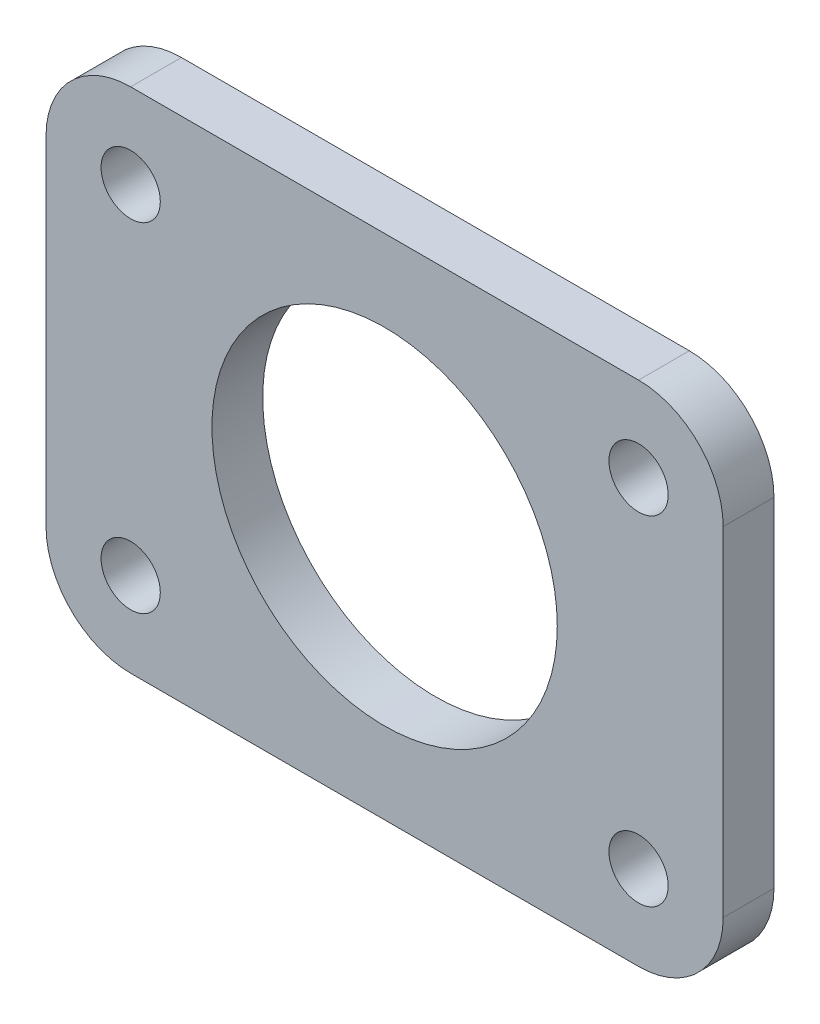
ISO-10303-21;
HEADER;
FILE_DESCRIPTION(('STEP AP214'),'2;1');
FILE_NAME('part.step','',(''),(''),'','','');
FILE_SCHEMA(('AUTOMOTIVE_DESIGN { 1 0 10303 214 1 1 1 1 }'));
ENDSEC;
DATA;
#1=APPLICATION_CONTEXT('core data for automotive mechanical design processes');
#2=APPLICATION_PROTOCOL_DEFINITION('international standard','automotive_design',2000,#1);
#3=PRODUCT_CONTEXT('',#1,'mechanical');
#4=PRODUCT('Part','Part','',(#3));
#5=PRODUCT_RELATED_PRODUCT_CATEGORY('part','',(#4));
#6=PRODUCT_DEFINITION_FORMATION('','',#4);
#7=PRODUCT_DEFINITION_CONTEXT('part definition',#1,'design');
#8=PRODUCT_DEFINITION('design','',#6,#7);
#9=PRODUCT_DEFINITION_SHAPE('','',#8);
#10=(LENGTH_UNIT() NAMED_UNIT(*) SI_UNIT(.MILLI.,.METRE.));
#11=(NAMED_UNIT(*) PLANE_ANGLE_UNIT() SI_UNIT($,.RADIAN.));
#12=(NAMED_UNIT(*) SI_UNIT($,.STERADIAN.) SOLID_ANGLE_UNIT());
#13=UNCERTAINTY_MEASURE_WITH_UNIT(LENGTH_MEASURE(1.E-05),#10,'distance_accuracy_value','');
#14=(GEOMETRIC_REPRESENTATION_CONTEXT(3) GLOBAL_UNCERTAINTY_ASSIGNED_CONTEXT((#13)) GLOBAL_UNIT_ASSIGNED_CONTEXT((#10,
#11,#12)) REPRESENTATION_CONTEXT('',''));
#15=CARTESIAN_POINT('',(0.,0.,0.));
#16=DIRECTION('',(0.,0.,1.));
#17=DIRECTION('',(1.,0.,0.));
#18=AXIS2_PLACEMENT_3D('',#15,#16,#17);
#19=CARTESIAN_POINT('',(-31.0674010943928,-12.3215053763443,10.));
#20=DIRECTION('',(0.,0.,-1.));
#21=DIRECTION('',(-1.,0.,0.));
#22=AXIS2_PLACEMENT_3D('',#19,#20,#21);
#23=CYLINDRICAL_SURFACE('',#22,1.75);
#24=CARTESIAN_POINT('',(-31.0674010943928,-12.3215053763443,7.));
#25=DIRECTION('',(0.,0.,1.));
#26=DIRECTION('',(1.,0.,0.));
#27=AXIS2_PLACEMENT_3D('',#24,#25,#26);
#28=CIRCLE('',#27,1.75);
#29=CARTESIAN_POINT('',(-29.3174010943928,-12.3215053763443,7.));
#30=VERTEX_POINT('',#29);
#31=EDGE_CURVE('E182',#30,#30,#28,.T.);
#32=ORIENTED_EDGE('',*,*,#31,.F.);
#33=EDGE_LOOP('',(#32));
#34=FACE_BOUND('',#33,.T.);
#35=CARTESIAN_POINT('',(-31.0674010943928,-12.3215053763443,10.));
#36=DIRECTION('',(0.,0.,1.));
#37=DIRECTION('',(1.,0.,0.));
#38=AXIS2_PLACEMENT_3D('',#35,#36,#37);
#39=CIRCLE('',#38,1.75);
#40=CARTESIAN_POINT('',(-29.3174010943928,-12.3215053763443,10.));
#41=VERTEX_POINT('',#40);
#42=EDGE_CURVE('E194',#41,#41,#39,.T.);
#43=ORIENTED_EDGE('',*,*,#42,.T.);
#44=EDGE_LOOP('',(#43));
#45=FACE_BOUND('',#44,.T.);
#46=ADVANCED_FACE('F34',(#34,#45),#23,.F.);
#47=CARTESIAN_POINT('',(-1.06740109439277,-12.3215053763441,10.));
#48=DIRECTION('',(0.,0.,-1.));
#49=DIRECTION('',(-1.,0.,0.));
#50=AXIS2_PLACEMENT_3D('',#47,#48,#49);
#51=CYLINDRICAL_SURFACE('',#50,1.75);
#52=CARTESIAN_POINT('',(-1.06740109439277,-12.3215053763441,7.));
#53=DIRECTION('',(0.,0.,1.));
#54=DIRECTION('',(1.,0.,0.));
#55=AXIS2_PLACEMENT_3D('',#52,#53,#54);
#56=CIRCLE('',#55,1.75);
#57=CARTESIAN_POINT('',(0.68259890560723,-12.3215053763441,7.));
#58=VERTEX_POINT('',#57);
#59=EDGE_CURVE('E179',#58,#58,#56,.T.);
#60=ORIENTED_EDGE('',*,*,#59,.F.);
#61=EDGE_LOOP('',(#60));
#62=FACE_BOUND('',#61,.T.);
#63=CARTESIAN_POINT('',(-1.06740109439277,-12.3215053763441,10.));
#64=DIRECTION('',(0.,0.,1.));
#65=DIRECTION('',(1.,0.,0.));
#66=AXIS2_PLACEMENT_3D('',#63,#64,#65);
#67=CIRCLE('',#66,1.75);
#68=CARTESIAN_POINT('',(0.68259890560723,-12.3215053763441,10.));
#69=VERTEX_POINT('',#68);
#70=EDGE_CURVE('E191',#69,#69,#67,.T.);
#71=ORIENTED_EDGE('',*,*,#70,.T.);
#72=EDGE_LOOP('',(#71));
#73=FACE_BOUND('',#72,.T.);
#74=ADVANCED_FACE('F218',(#62,#73),#51,.F.);
#75=CARTESIAN_POINT('',(-16.067401094393,-2.32150537634408,10.));
#76=DIRECTION('',(0.,0.,1.));
#77=DIRECTION('',(1.,0.,0.));
#78=AXIS2_PLACEMENT_3D('',#75,#76,#77);
#79=PLANE('',#78);
#80=DIRECTION('',(0.,-1.,0.));
#81=VECTOR('',#80,1.);
#82=CARTESIAN_POINT('',(-36.067401094393,-17.3215053763441,10.));
#83=LINE('',#82,#81);
#84=CARTESIAN_POINT('',(-36.067401094393,7.67849462365592,10.));
#85=VERTEX_POINT('',#84);
#86=CARTESIAN_POINT('',(-36.067401094393,-12.3215053763441,10.));
#87=VERTEX_POINT('',#86);
#88=EDGE_CURVE('E129',#85,#87,#83,.T.);
#89=ORIENTED_EDGE('',*,*,#88,.T.);
#90=CARTESIAN_POINT('',(-31.067401094393,-12.3215053763441,10.));
#91=DIRECTION('',(0.,0.,1.));
#92=DIRECTION('',(1.,0.,0.));
#93=AXIS2_PLACEMENT_3D('',#90,#91,#92);
#94=CIRCLE('',#93,5.);
#95=CARTESIAN_POINT('',(-31.067401094393,-17.3215053763441,10.));
#96=VERTEX_POINT('',#95);
#97=EDGE_CURVE('E42',#87,#96,#94,.T.);
#98=ORIENTED_EDGE('',*,*,#97,.T.);
#99=DIRECTION('',(1.,0.,0.));
#100=VECTOR('',#99,1.);
#101=CARTESIAN_POINT('',(13.932598905607,-17.3215053763441,10.));
#102=LINE('',#101,#100);
#103=CARTESIAN_POINT('',(-1.06740109439297,-17.3215053763441,10.));
#104=VERTEX_POINT('',#103);
#105=EDGE_CURVE('E124',#96,#104,#102,.T.);
#106=ORIENTED_EDGE('',*,*,#105,.T.);
#107=CARTESIAN_POINT('',(-1.06740109439297,-12.3215053763441,10.));
#108=DIRECTION('',(0.,0.,1.));
#109=DIRECTION('',(1.,0.,0.));
#110=AXIS2_PLACEMENT_3D('',#107,#108,#109);
#111=CIRCLE('',#110,5.);
#112=CARTESIAN_POINT('',(3.93259890560703,-12.3215053763441,10.));
#113=VERTEX_POINT('',#112);
#114=EDGE_CURVE('E49',#104,#113,#111,.T.);
#115=ORIENTED_EDGE('',*,*,#114,.T.);
#116=DIRECTION('',(0.,1.,0.));
#117=VECTOR('',#116,1.);
#118=CARTESIAN_POINT('',(3.93259890560703,12.6784946236559,10.));
#119=LINE('',#118,#117);
#120=CARTESIAN_POINT('',(3.93259890560703,7.67849462365592,10.));
#121=VERTEX_POINT('',#120);
#122=EDGE_CURVE('E203',#113,#121,#119,.T.);
#123=ORIENTED_EDGE('',*,*,#122,.T.);
#124=CARTESIAN_POINT('',(-1.06740109439297,7.67849462365592,10.));
#125=DIRECTION('',(0.,0.,1.));
#126=DIRECTION('',(1.,0.,0.));
#127=AXIS2_PLACEMENT_3D('',#124,#125,#126);
#128=CIRCLE('',#127,5.);
#129=CARTESIAN_POINT('',(-1.06740109439297,12.6784946236559,10.));
#130=VERTEX_POINT('',#129);
#131=EDGE_CURVE('E140',#121,#130,#128,.T.);
#132=ORIENTED_EDGE('',*,*,#131,.T.);
#133=DIRECTION('',(-1.,0.,0.));
#134=VECTOR('',#133,1.);
#135=CARTESIAN_POINT('',(-36.067401094393,12.6784946236559,10.));
#136=LINE('',#135,#134);
#137=CARTESIAN_POINT('',(-31.067401094393,12.6784946236559,10.));
#138=VERTEX_POINT('',#137);
#139=EDGE_CURVE('E133',#130,#138,#136,.T.);
#140=ORIENTED_EDGE('',*,*,#139,.T.);
#141=CARTESIAN_POINT('',(-31.067401094393,7.67849462365592,10.));
#142=DIRECTION('',(0.,0.,1.));
#143=DIRECTION('',(1.,0.,0.));
#144=AXIS2_PLACEMENT_3D('',#141,#142,#143);
#145=CIRCLE('',#144,5.);
#146=EDGE_CURVE('E128',#138,#85,#145,.T.);
#147=ORIENTED_EDGE('',*,*,#146,.T.);
#148=EDGE_LOOP('',(#89,#98,#106,#115,#123,#132,#140,#147));
#149=FACE_BOUND('',#148,.T.);
#150=ORIENTED_EDGE('',*,*,#42,.F.);
#151=EDGE_LOOP('',(#150));
#152=FACE_BOUND('',#151,.T.);
#153=CARTESIAN_POINT('',(-1.06740109439298,7.67849462365592,10.));
#154=DIRECTION('',(0.,0.,1.));
#155=DIRECTION('',(1.,0.,0.));
#156=AXIS2_PLACEMENT_3D('',#153,#154,#155);
#157=CIRCLE('',#156,1.75);
#158=CARTESIAN_POINT('',(0.682598905607022,7.67849462365592,10.));
#159=VERTEX_POINT('',#158);
#160=EDGE_CURVE('E200',#159,#159,#157,.T.);
#161=ORIENTED_EDGE('',*,*,#160,.F.);
#162=EDGE_LOOP('',(#161));
#163=FACE_BOUND('',#162,.T.);
#164=CARTESIAN_POINT('',(-31.067401094393,7.67849462365571,10.));
#165=DIRECTION('',(0.,0.,1.));
#166=DIRECTION('',(1.,0.,0.));
#167=AXIS2_PLACEMENT_3D('',#164,#165,#166);
#168=CIRCLE('',#167,1.75);
#169=CARTESIAN_POINT('',(-29.317401094393,7.67849462365571,10.));
#170=VERTEX_POINT('',#169);
#171=EDGE_CURVE('E197',#170,#170,#168,.T.);
#172=ORIENTED_EDGE('',*,*,#171,.F.);
#173=EDGE_LOOP('',(#172));
#174=FACE_BOUND('',#173,.T.);
#175=ORIENTED_EDGE('',*,*,#70,.F.);
#176=EDGE_LOOP('',(#175));
#177=FACE_BOUND('',#176,.T.);
#178=CARTESIAN_POINT('',(-16.067401094393,-2.32150537634408,10.));
#179=DIRECTION('',(0.,0.,1.));
#180=DIRECTION('',(1.,0.,0.));
#181=AXIS2_PLACEMENT_3D('',#178,#179,#180);
#182=CIRCLE('',#181,10.2);
#183=CARTESIAN_POINT('',(-5.86740109439297,-2.32150537634408,10.));
#184=VERTEX_POINT('',#183);
#185=EDGE_CURVE('E185',#184,#184,#182,.T.);
#186=ORIENTED_EDGE('',*,*,#185,.F.);
#187=EDGE_LOOP('',(#186));
#188=FACE_BOUND('',#187,.T.);
#189=ADVANCED_FACE('F156',(#149,#152,#163,#174,#177,#188),#79,.T.);
#190=CARTESIAN_POINT('',(3.93259890560703,12.6784946236559,10.));
#191=DIRECTION('',(-1.,0.,0.));
#192=DIRECTION('',(0.,-1.,0.));
#193=AXIS2_PLACEMENT_3D('',#190,#191,#192);
#194=PLANE('',#193);
#195=ORIENTED_EDGE('',*,*,#122,.F.);
#196=DIRECTION('',(0.,0.,-1.));
#197=VECTOR('',#196,1.);
#198=CARTESIAN_POINT('',(3.93259890560703,-12.3215053763441,10.));
#199=LINE('',#198,#197);
#200=CARTESIAN_POINT('',(3.93259890560703,-12.3215053763441,7.));
#201=VERTEX_POINT('',#200);
#202=EDGE_CURVE('E12',#113,#201,#199,.T.);
#203=ORIENTED_EDGE('',*,*,#202,.T.);
#204=DIRECTION('',(0.,1.,0.));
#205=VECTOR('',#204,1.);
#206=CARTESIAN_POINT('',(3.93259890560703,12.6784946236559,7.));
#207=LINE('',#206,#205);
#208=CARTESIAN_POINT('',(3.93259890560703,7.67849462365592,7.));
#209=VERTEX_POINT('',#208);
#210=EDGE_CURVE('E169',#201,#209,#207,.T.);
#211=ORIENTED_EDGE('',*,*,#210,.T.);
#212=DIRECTION('',(0.,0.,-1.));
#213=VECTOR('',#212,1.);
#214=CARTESIAN_POINT('',(3.93259890560703,7.67849462365592,10.));
#215=LINE('',#214,#213);
#216=EDGE_CURVE('E131',#209,#121,#215,.F.);
#217=ORIENTED_EDGE('',*,*,#216,.T.);
#218=EDGE_LOOP('',(#195,#203,#211,#217));
#219=FACE_BOUND('',#218,.T.);
#220=ADVANCED_FACE('F210',(#219),#194,.F.);
#221=CARTESIAN_POINT('',(-36.067401094393,12.6784946236559,10.));
#222=DIRECTION('',(0.,-1.,0.));
#223=DIRECTION('',(1.,0.,0.));
#224=AXIS2_PLACEMENT_3D('',#221,#222,#223);
#225=PLANE('',#224);
#226=DIRECTION('',(0.,0.,-1.));
#227=VECTOR('',#226,1.);
#228=CARTESIAN_POINT('',(-1.06740109439297,12.6784946236559,10.));
#229=LINE('',#228,#227);
#230=CARTESIAN_POINT('',(-1.06740109439297,12.6784946236559,7.));
#231=VERTEX_POINT('',#230);
#232=EDGE_CURVE('E123',#130,#231,#229,.T.);
#233=ORIENTED_EDGE('',*,*,#232,.T.);
#234=DIRECTION('',(1.,0.,0.));
#235=VECTOR('',#234,1.);
#236=CARTESIAN_POINT('',(13.932598905607,12.6784946236559,7.));
#237=LINE('',#236,#235);
#238=CARTESIAN_POINT('',(-31.067401094393,12.6784946236559,7.));
#239=VERTEX_POINT('',#238);
#240=EDGE_CURVE('E106',#239,#231,#237,.T.);
#241=ORIENTED_EDGE('',*,*,#240,.F.);
#242=DIRECTION('',(0.,0.,-1.));
#243=VECTOR('',#242,1.);
#244=CARTESIAN_POINT('',(-31.067401094393,12.6784946236559,10.));
#245=LINE('',#244,#243);
#246=EDGE_CURVE('E120',#239,#138,#245,.F.);
#247=ORIENTED_EDGE('',*,*,#246,.T.);
#248=ORIENTED_EDGE('',*,*,#139,.F.);
#249=EDGE_LOOP('',(#233,#241,#247,#248));
#250=FACE_BOUND('',#249,.T.);
#251=ADVANCED_FACE('F118',(#250),#225,.F.);
#252=CARTESIAN_POINT('',(-36.067401094393,-17.3215053763441,10.));
#253=DIRECTION('',(1.,0.,0.));
#254=DIRECTION('',(0.,1.,0.));
#255=AXIS2_PLACEMENT_3D('',#252,#253,#254);
#256=PLANE('',#255);
#257=DIRECTION('',(0.,-1.,0.));
#258=VECTOR('',#257,1.);
#259=CARTESIAN_POINT('',(-36.067401094393,-17.3215053763441,7.));
#260=LINE('',#259,#258);
#261=CARTESIAN_POINT('',(-36.067401094393,7.67849462365592,7.));
#262=VERTEX_POINT('',#261);
#263=CARTESIAN_POINT('',(-36.067401094393,-12.3215053763441,7.));
#264=VERTEX_POINT('',#263);
#265=EDGE_CURVE('E108',#262,#264,#260,.T.);
#266=ORIENTED_EDGE('',*,*,#265,.T.);
#267=DIRECTION('',(0.,0.,-1.));
#268=VECTOR('',#267,1.);
#269=CARTESIAN_POINT('',(-36.067401094393,-12.3215053763441,10.));
#270=LINE('',#269,#268);
#271=EDGE_CURVE('E57',#264,#87,#270,.F.);
#272=ORIENTED_EDGE('',*,*,#271,.T.);
#273=ORIENTED_EDGE('',*,*,#88,.F.);
#274=DIRECTION('',(0.,0.,-1.));
#275=VECTOR('',#274,1.);
#276=CARTESIAN_POINT('',(-36.067401094393,7.67849462365592,10.));
#277=LINE('',#276,#275);
#278=EDGE_CURVE('E114',#85,#262,#277,.T.);
#279=ORIENTED_EDGE('',*,*,#278,.T.);
#280=EDGE_LOOP('',(#266,#272,#273,#279));
#281=FACE_BOUND('',#280,.T.);
#282=ADVANCED_FACE('F166',(#281),#256,.F.);
#283=CARTESIAN_POINT('',(-1.06740109439298,7.67849462365592,10.));
#284=DIRECTION('',(0.,0.,-1.));
#285=DIRECTION('',(-1.,0.,0.));
#286=AXIS2_PLACEMENT_3D('',#283,#284,#285);
#287=CYLINDRICAL_SURFACE('',#286,1.75);
#288=CARTESIAN_POINT('',(-1.06740109439298,7.67849462365592,7.));
#289=DIRECTION('',(0.,0.,1.));
#290=DIRECTION('',(1.,0.,0.));
#291=AXIS2_PLACEMENT_3D('',#288,#289,#290);
#292=CIRCLE('',#291,1.75);
#293=CARTESIAN_POINT('',(0.682598905607022,7.67849462365592,7.));
#294=VERTEX_POINT('',#293);
#295=EDGE_CURVE('E176',#294,#294,#292,.T.);
#296=ORIENTED_EDGE('',*,*,#295,.F.);
#297=EDGE_LOOP('',(#296));
#298=FACE_BOUND('',#297,.T.);
#299=ORIENTED_EDGE('',*,*,#160,.T.);
#300=EDGE_LOOP('',(#299));
#301=FACE_BOUND('',#300,.T.);
#302=ADVANCED_FACE('F234',(#298,#301),#287,.F.);
#303=CARTESIAN_POINT('',(-31.067401094393,7.67849462365571,10.));
#304=DIRECTION('',(0.,0.,-1.));
#305=DIRECTION('',(-1.,0.,0.));
#306=AXIS2_PLACEMENT_3D('',#303,#304,#305);
#307=CYLINDRICAL_SURFACE('',#306,1.75);
#308=CARTESIAN_POINT('',(-31.067401094393,7.67849462365571,7.));
#309=DIRECTION('',(0.,0.,1.));
#310=DIRECTION('',(1.,0.,0.));
#311=AXIS2_PLACEMENT_3D('',#308,#309,#310);
#312=CIRCLE('',#311,1.75);
#313=CARTESIAN_POINT('',(-29.317401094393,7.67849462365571,7.));
#314=VERTEX_POINT('',#313);
#315=EDGE_CURVE('E173',#314,#314,#312,.T.);
#316=ORIENTED_EDGE('',*,*,#315,.F.);
#317=EDGE_LOOP('',(#316));
#318=FACE_BOUND('',#317,.T.);
#319=ORIENTED_EDGE('',*,*,#171,.T.);
#320=EDGE_LOOP('',(#319));
#321=FACE_BOUND('',#320,.T.);
#322=ADVANCED_FACE('F230',(#318,#321),#307,.F.);
#323=CARTESIAN_POINT('',(-16.067401094393,-2.32150537634408,-31.6783837971573));
#324=DIRECTION('',(0.,0.,1.));
#325=DIRECTION('',(1.,0.,0.));
#326=AXIS2_PLACEMENT_3D('',#323,#324,#325);
#327=CYLINDRICAL_SURFACE('',#326,10.2);
#328=CARTESIAN_POINT('',(-16.067401094393,-2.32150537634408,7.00000000000002));
#329=DIRECTION('',(0.,0.,1.));
#330=DIRECTION('',(1.,0.,0.));
#331=AXIS2_PLACEMENT_3D('',#328,#329,#330);
#332=CIRCLE('',#331,10.2);
#333=CARTESIAN_POINT('',(-5.86740109439297,-2.32150537634408,7.00000000000001));
#334=VERTEX_POINT('',#333);
#335=EDGE_CURVE('E188',#334,#334,#332,.F.);
#336=CARTESIAN_POINT('',(-5.86740109439297,-2.32150537634408,7.00000000000001));
#337=CARTESIAN_POINT('',(-5.86740109439297,-2.32150537634408,7.03125000000001));
#338=CARTESIAN_POINT('',(-5.86740109439297,-2.32150537634408,7.06250000000002));
#339=CARTESIAN_POINT('',(-5.86740109439297,-2.32150537634408,7.12500000000002));
#340=CARTESIAN_POINT('',(-5.86740109439297,-2.32150537634408,7.15625000000001));
#341=CARTESIAN_POINT('',(-5.86740109439297,-2.32150537634408,7.21875000000001));
#342=CARTESIAN_POINT('',(-5.86740109439297,-2.32150537634408,7.25000000000001));
#343=CARTESIAN_POINT('',(-5.86740109439297,-2.32150537634408,7.31250000000001));
#344=CARTESIAN_POINT('',(-5.86740109439297,-2.32150537634408,7.34375000000001));
#345=CARTESIAN_POINT('',(-5.86740109439297,-2.32150537634408,7.40625000000001));
#346=CARTESIAN_POINT('',(-5.86740109439297,-2.32150537634408,7.43750000000002));
#347=CARTESIAN_POINT('',(-5.86740109439297,-2.32150537634408,7.50000000000002));
#348=CARTESIAN_POINT('',(-5.86740109439297,-2.32150537634408,7.53125000000001));
#349=CARTESIAN_POINT('',(-5.86740109439297,-2.32150537634408,7.59375000000001));
#350=CARTESIAN_POINT('',(-5.86740109439297,-2.32150537634408,7.62500000000001));
#351=CARTESIAN_POINT('',(-5.86740109439297,-2.32150537634408,7.68750000000001));
#352=CARTESIAN_POINT('',(-5.86740109439297,-2.32150537634408,7.71875000000001));
#353=CARTESIAN_POINT('',(-5.86740109439297,-2.32150537634408,7.78125000000002));
#354=CARTESIAN_POINT('',(-5.86740109439297,-2.32150537634408,7.81250000000002));
#355=CARTESIAN_POINT('',(-5.86740109439297,-2.32150537634408,7.87500000000002));
#356=CARTESIAN_POINT('',(-5.86740109439297,-2.32150537634408,7.90625000000002));
#357=CARTESIAN_POINT('',(-5.86740109439297,-2.32150537634408,7.96875000000001));
#358=CARTESIAN_POINT('',(-5.86740109439297,-2.32150537634408,8.00000000000001));
#359=CARTESIAN_POINT('',(-5.86740109439297,-2.32150537634408,8.06250000000001));
#360=CARTESIAN_POINT('',(-5.86740109439297,-2.32150537634408,8.09375000000001));
#361=CARTESIAN_POINT('',(-5.86740109439297,-2.32150537634408,8.15625000000002));
#362=CARTESIAN_POINT('',(-5.86740109439297,-2.32150537634408,8.18750000000002));
#363=CARTESIAN_POINT('',(-5.86740109439297,-2.32150537634408,8.25000000000002));
#364=CARTESIAN_POINT('',(-5.86740109439297,-2.32150537634408,8.28125000000002));
#365=CARTESIAN_POINT('',(-5.86740109439297,-2.32150537634408,8.34375000000001));
#366=CARTESIAN_POINT('',(-5.86740109439297,-2.32150537634408,8.37500000000001));
#367=CARTESIAN_POINT('',(-5.86740109439297,-2.32150537634408,8.43750000000001));
#368=CARTESIAN_POINT('',(-5.86740109439297,-2.32150537634408,8.46875000000001));
#369=CARTESIAN_POINT('',(-5.86740109439297,-2.32150537634408,8.53125000000002));
#370=CARTESIAN_POINT('',(-5.86740109439297,-2.32150537634408,8.56250000000002));
#371=CARTESIAN_POINT('',(-5.86740109439297,-2.32150537634408,8.62500000000002));
#372=CARTESIAN_POINT('',(-5.86740109439297,-2.32150537634408,8.65625000000002));
#373=CARTESIAN_POINT('',(-5.86740109439297,-2.32150537634408,8.71875000000001));
#374=CARTESIAN_POINT('',(-5.86740109439297,-2.32150537634408,8.75000000000001));
#375=CARTESIAN_POINT('',(-5.86740109439297,-2.32150537634408,8.81250000000001));
#376=CARTESIAN_POINT('',(-5.86740109439297,-2.32150537634408,8.84375000000001));
#377=CARTESIAN_POINT('',(-5.86740109439297,-2.32150537634408,8.90625000000002));
#378=CARTESIAN_POINT('',(-5.86740109439297,-2.32150537634408,8.93750000000002));
#379=CARTESIAN_POINT('',(-5.86740109439297,-2.32150537634408,9.00000000000002));
#380=CARTESIAN_POINT('',(-5.86740109439297,-2.32150537634408,9.03125000000002));
#381=CARTESIAN_POINT('',(-5.86740109439297,-2.32150537634408,9.09375000000001));
#382=CARTESIAN_POINT('',(-5.86740109439297,-2.32150537634408,9.12500000000001));
#383=CARTESIAN_POINT('',(-5.86740109439297,-2.32150537634408,9.18750000000001));
#384=CARTESIAN_POINT('',(-5.86740109439297,-2.32150537634408,9.21875000000001));
#385=CARTESIAN_POINT('',(-5.86740109439297,-2.32150537634408,9.28125000000002));
#386=CARTESIAN_POINT('',(-5.86740109439297,-2.32150537634408,9.31250000000002));
#387=CARTESIAN_POINT('',(-5.86740109439297,-2.32150537634408,9.37500000000002));
#388=CARTESIAN_POINT('',(-5.86740109439297,-2.32150537634408,9.40625000000002));
#389=CARTESIAN_POINT('',(-5.86740109439297,-2.32150537634408,9.46875000000001));
#390=CARTESIAN_POINT('',(-5.86740109439297,-2.32150537634408,9.50000000000001));
#391=CARTESIAN_POINT('',(-5.86740109439297,-2.32150537634408,9.56250000000001));
#392=CARTESIAN_POINT('',(-5.86740109439297,-2.32150537634408,9.59375000000001));
#393=CARTESIAN_POINT('',(-5.86740109439297,-2.32150537634408,9.65625000000002));
#394=CARTESIAN_POINT('',(-5.86740109439297,-2.32150537634408,9.68750000000002));
#395=CARTESIAN_POINT('',(-5.86740109439297,-2.32150537634408,9.75000000000002));
#396=CARTESIAN_POINT('',(-5.86740109439297,-2.32150537634408,9.78125000000002));
#397=CARTESIAN_POINT('',(-5.86740109439297,-2.32150537634408,9.84375000000001));
#398=CARTESIAN_POINT('',(-5.86740109439297,-2.32150537634408,9.87500000000001));
#399=CARTESIAN_POINT('',(-5.86740109439297,-2.32150537634408,9.93750000000001));
#400=CARTESIAN_POINT('',(-5.86740109439297,-2.32150537634408,9.96875000000001));
#401=CARTESIAN_POINT('',(-5.86740109439297,-2.32150537634408,10.));
#402=B_SPLINE_CURVE_WITH_KNOTS('',3,(#336,#337,#338,#339,#340,#341,#342,#343,#344,#345,#346,
#347,#348,#349,#350,#351,#352,#353,#354,#355,#356,#357,#358,#359,#360,#361,#362,#363,#364,#365,
#366,#367,#368,#369,#370,#371,#372,#373,#374,#375,#376,#377,#378,#379,#380,#381,#382,#383,#384,
#385,#386,#387,#388,#389,#390,#391,#392,#393,#394,#395,#396,#397,#398,#399,#400,#401),
.UNSPECIFIED.,.F.,.F.,(4,2,2,2,2,2,2,2,2,2,2,2,2,2,2,2,2,2,2,2,2,2,2,2,2,2,2,2,2,2,2,2,4),(0.,
0.0937500000000036,0.1875,0.281249999999997,0.375,0.468750000000004,0.5625,0.656249999999997,
0.750000000000001,0.843750000000004,0.937500000000001,1.03125,1.125,1.21875,1.3125,1.40625,1.5,
1.59375,1.6875,1.78125,1.875,1.96875000000001,2.0625,2.15625,2.25,2.34375000000001,2.4375,
2.53125,2.625,2.71875000000001,2.8125,2.90625,3.),.UNSPECIFIED.);
#403=EDGE_CURVE('BSEAM233',#334,#184,#402,.T.);
#404=ORIENTED_EDGE('',*,*,#335,.T.);
#405=ORIENTED_EDGE('',*,*,#185,.T.);
#406=ORIENTED_EDGE('',*,*,#403,.T.);
#407=ORIENTED_EDGE('',*,*,#403,.F.);
#408=EDGE_LOOP('',(#404,#406,#405,#407));
#409=FACE_BOUND('',#408,.T.);
#410=ADVANCED_FACE('F233',(#409),#327,.F.);
#411=CARTESIAN_POINT('',(-16.067401094393,-2.32150537634408,7.00000000000002));
#412=DIRECTION('',(0.,0.,1.));
#413=DIRECTION('',(1.,0.,0.));
#414=AXIS2_PLACEMENT_3D('',#411,#412,#413);
#415=PLANE('',#414);
#416=ORIENTED_EDGE('',*,*,#335,.F.);
#417=EDGE_LOOP('',(#416));
#418=FACE_BOUND('',#417,.T.);
#419=ORIENTED_EDGE('',*,*,#31,.T.);
#420=EDGE_LOOP('',(#419));
#421=FACE_BOUND('',#420,.T.);
#422=ORIENTED_EDGE('',*,*,#59,.T.);
#423=EDGE_LOOP('',(#422));
#424=FACE_BOUND('',#423,.T.);
#425=ORIENTED_EDGE('',*,*,#295,.T.);
#426=EDGE_LOOP('',(#425));
#427=FACE_BOUND('',#426,.T.);
#428=ORIENTED_EDGE('',*,*,#315,.T.);
#429=EDGE_LOOP('',(#428));
#430=FACE_BOUND('',#429,.T.);
#431=DIRECTION('',(-1.,0.,0.));
#432=VECTOR('',#431,1.);
#433=CARTESIAN_POINT('',(-16.067401094393,-17.3215053763441,7.00000000000002));
#434=LINE('',#433,#432);
#435=CARTESIAN_POINT('',(-1.06740109439297,-17.3215053763441,7.00000000000002));
#436=VERTEX_POINT('',#435);
#437=CARTESIAN_POINT('',(-31.067401094393,-17.3215053763441,7.00000000000002));
#438=VERTEX_POINT('',#437);
#439=EDGE_CURVE('E113',#436,#438,#434,.T.);
#440=ORIENTED_EDGE('',*,*,#439,.T.);
#441=CARTESIAN_POINT('',(-31.067401094393,-12.3215053763441,7.00000000000002));
#442=DIRECTION('',(0.,0.,1.));
#443=DIRECTION('',(1.,0.,0.));
#444=AXIS2_PLACEMENT_3D('',#441,#442,#443);
#445=CIRCLE('',#444,5.);
#446=EDGE_CURVE('E151',#438,#264,#445,.F.);
#447=ORIENTED_EDGE('',*,*,#446,.T.);
#448=ORIENTED_EDGE('',*,*,#265,.F.);
#449=CARTESIAN_POINT('',(-31.067401094393,7.67849462365592,7.));
#450=DIRECTION('',(0.,0.,1.));
#451=DIRECTION('',(1.,0.,0.));
#452=AXIS2_PLACEMENT_3D('',#449,#450,#451);
#453=CIRCLE('',#452,5.);
#454=EDGE_CURVE('E101',#262,#239,#453,.F.);
#455=ORIENTED_EDGE('',*,*,#454,.T.);
#456=ORIENTED_EDGE('',*,*,#240,.T.);
#457=CARTESIAN_POINT('',(-1.06740109439297,7.67849462365592,7.));
#458=DIRECTION('',(0.,0.,1.));
#459=DIRECTION('',(1.,0.,0.));
#460=AXIS2_PLACEMENT_3D('',#457,#458,#459);
#461=CIRCLE('',#460,5.);
#462=EDGE_CURVE('E167',#231,#209,#461,.F.);
#463=ORIENTED_EDGE('',*,*,#462,.T.);
#464=ORIENTED_EDGE('',*,*,#210,.F.);
#465=CARTESIAN_POINT('',(-1.06740109439297,-12.3215053763441,7.00000000000002));
#466=DIRECTION('',(0.,0.,1.));
#467=DIRECTION('',(1.,0.,0.));
#468=AXIS2_PLACEMENT_3D('',#465,#466,#467);
#469=CIRCLE('',#468,5.);
#470=EDGE_CURVE('E149',#201,#436,#469,.F.);
#471=ORIENTED_EDGE('',*,*,#470,.T.);
#472=EDGE_LOOP('',(#440,#447,#448,#455,#456,#463,#464,#471));
#473=FACE_BOUND('',#472,.T.);
#474=ADVANCED_FACE('F104',(#418,#421,#424,#427,#430,#473),#415,.F.);
#475=CARTESIAN_POINT('',(-1.06740109439297,7.67849462365592,10.));
#476=DIRECTION('',(0.,0.,-1.));
#477=DIRECTION('',(-1.,0.,0.));
#478=AXIS2_PLACEMENT_3D('',#475,#476,#477);
#479=CYLINDRICAL_SURFACE('',#478,5.);
#480=ORIENTED_EDGE('',*,*,#462,.F.);
#481=ORIENTED_EDGE('',*,*,#232,.F.);
#482=ORIENTED_EDGE('',*,*,#131,.F.);
#483=ORIENTED_EDGE('',*,*,#216,.F.);
#484=EDGE_LOOP('',(#480,#481,#482,#483));
#485=FACE_BOUND('',#484,.T.);
#486=ADVANCED_FACE('F206',(#485),#479,.T.);
#487=CARTESIAN_POINT('',(-31.067401094393,7.67849462365592,10.));
#488=DIRECTION('',(0.,0.,-1.));
#489=DIRECTION('',(-1.,0.,0.));
#490=AXIS2_PLACEMENT_3D('',#487,#488,#489);
#491=CYLINDRICAL_SURFACE('',#490,5.);
#492=ORIENTED_EDGE('',*,*,#454,.F.);
#493=ORIENTED_EDGE('',*,*,#278,.F.);
#494=ORIENTED_EDGE('',*,*,#146,.F.);
#495=ORIENTED_EDGE('',*,*,#246,.F.);
#496=EDGE_LOOP('',(#492,#493,#494,#495));
#497=FACE_BOUND('',#496,.T.);
#498=ADVANCED_FACE('F127',(#497),#491,.T.);
#499=CARTESIAN_POINT('',(13.932598905607,-17.3215053763441,10.));
#500=DIRECTION('',(0.,1.,0.));
#501=DIRECTION('',(0.,0.,1.));
#502=AXIS2_PLACEMENT_3D('',#499,#500,#501);
#503=PLANE('',#502);
#504=ORIENTED_EDGE('',*,*,#105,.F.);
#505=DIRECTION('',(0.,0.,-1.));
#506=VECTOR('',#505,1.);
#507=CARTESIAN_POINT('',(-31.067401094393,-17.3215053763441,10.));
#508=LINE('',#507,#506);
#509=EDGE_CURVE('E146',#96,#438,#508,.T.);
#510=ORIENTED_EDGE('',*,*,#509,.T.);
#511=ORIENTED_EDGE('',*,*,#439,.F.);
#512=DIRECTION('',(0.,0.,-1.));
#513=VECTOR('',#512,1.);
#514=CARTESIAN_POINT('',(-1.06740109439297,-17.3215053763441,10.));
#515=LINE('',#514,#513);
#516=EDGE_CURVE('E144',#436,#104,#515,.F.);
#517=ORIENTED_EDGE('',*,*,#516,.T.);
#518=EDGE_LOOP('',(#504,#510,#511,#517));
#519=FACE_BOUND('',#518,.T.);
#520=ADVANCED_FACE('F161',(#519),#503,.F.);
#521=CARTESIAN_POINT('',(-31.067401094393,-12.3215053763441,10.));
#522=DIRECTION('',(0.,0.,-1.));
#523=DIRECTION('',(-1.,0.,0.));
#524=AXIS2_PLACEMENT_3D('',#521,#522,#523);
#525=CYLINDRICAL_SURFACE('',#524,5.);
#526=ORIENTED_EDGE('',*,*,#97,.F.);
#527=ORIENTED_EDGE('',*,*,#271,.F.);
#528=ORIENTED_EDGE('',*,*,#446,.F.);
#529=ORIENTED_EDGE('',*,*,#509,.F.);
#530=EDGE_LOOP('',(#526,#527,#528,#529));
#531=FACE_BOUND('',#530,.T.);
#532=ADVANCED_FACE('F165',(#531),#525,.T.);
#533=CARTESIAN_POINT('',(-1.06740109439297,-12.3215053763441,10.));
#534=DIRECTION('',(0.,0.,-1.));
#535=DIRECTION('',(-1.,0.,0.));
#536=AXIS2_PLACEMENT_3D('',#533,#534,#535);
#537=CYLINDRICAL_SURFACE('',#536,5.);
#538=ORIENTED_EDGE('',*,*,#114,.F.);
#539=ORIENTED_EDGE('',*,*,#516,.F.);
#540=ORIENTED_EDGE('',*,*,#470,.F.);
#541=ORIENTED_EDGE('',*,*,#202,.F.);
#542=EDGE_LOOP('',(#538,#539,#540,#541));
#543=FACE_BOUND('',#542,.T.);
#544=ADVANCED_FACE('F36',(#543),#537,.T.);
#545=CLOSED_SHELL('',(#46,#74,#189,#220,#251,#282,#302,#322,#410,#474,#486,#498,#520,#532,#544));
#546=MANIFOLD_SOLID_BREP('B2',#545);
#547=ADVANCED_BREP_SHAPE_REPRESENTATION('',(#18,#546),#14);
#548=SHAPE_DEFINITION_REPRESENTATION(#9,#547);
ENDSEC;
END-ISO-10303-21;
